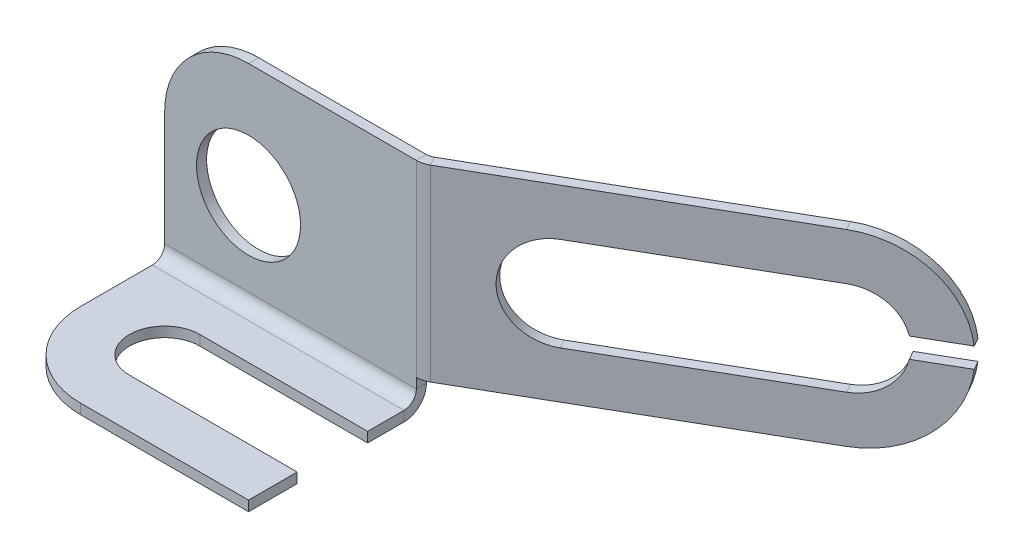
ISO-10303-21;
HEADER;
FILE_DESCRIPTION(('STEP AP214'),'2;1');
FILE_NAME('part.step','',(''),(''),'','','');
FILE_SCHEMA(('AUTOMOTIVE_DESIGN { 1 0 10303 214 1 1 1 1 }'));
ENDSEC;
DATA;
#1=APPLICATION_CONTEXT('core data for automotive mechanical design processes');
#2=APPLICATION_PROTOCOL_DEFINITION('international standard','automotive_design',2000,#1);
#3=PRODUCT_CONTEXT('',#1,'mechanical');
#4=PRODUCT('Part','Part','',(#3));
#5=PRODUCT_RELATED_PRODUCT_CATEGORY('part','',(#4));
#6=PRODUCT_DEFINITION_FORMATION('','',#4);
#7=PRODUCT_DEFINITION_CONTEXT('part definition',#1,'design');
#8=PRODUCT_DEFINITION('design','',#6,#7);
#9=PRODUCT_DEFINITION_SHAPE('','',#8);
#10=(LENGTH_UNIT() NAMED_UNIT(*) SI_UNIT(.MILLI.,.METRE.));
#11=(NAMED_UNIT(*) PLANE_ANGLE_UNIT() SI_UNIT($,.RADIAN.));
#12=(NAMED_UNIT(*) SI_UNIT($,.STERADIAN.) SOLID_ANGLE_UNIT());
#13=UNCERTAINTY_MEASURE_WITH_UNIT(LENGTH_MEASURE(1.E-05),#10,'distance_accuracy_value','');
#14=(GEOMETRIC_REPRESENTATION_CONTEXT(3) GLOBAL_UNCERTAINTY_ASSIGNED_CONTEXT((#13)) GLOBAL_UNIT_ASSIGNED_CONTEXT((#10,
#11,#12)) REPRESENTATION_CONTEXT('',''));
#15=CARTESIAN_POINT('',(0.,0.,0.));
#16=DIRECTION('',(0.,0.,1.));
#17=DIRECTION('',(1.,0.,0.));
#18=AXIS2_PLACEMENT_3D('',#15,#16,#17);
#19=CARTESIAN_POINT('',(28.7,1.2,0.));
#20=DIRECTION('',(0.,0.,1.));
#21=DIRECTION('',(1.,0.,0.));
#22=AXIS2_PLACEMENT_3D('',#19,#20,#21);
#23=PLANE('',#22);
#24=CARTESIAN_POINT('',(0.,0.,0.));
#25=DIRECTION('',(0.,0.,1.));
#26=DIRECTION('',(1.,0.,0.));
#27=AXIS2_PLACEMENT_3D('',#24,#25,#26);
#28=CIRCLE('',#27,3.1);
#29=CARTESIAN_POINT('',(3.1,0.,0.));
#30=VERTEX_POINT('',#29);
#31=EDGE_CURVE('E391',#30,#30,#28,.T.);
#32=ORIENTED_EDGE('',*,*,#31,.F.);
#33=EDGE_LOOP('',(#32));
#34=FACE_BOUND('',#33,.T.);
#35=DIRECTION('',(0.,1.,0.));
#36=VECTOR('',#35,1.);
#37=CARTESIAN_POINT('',(10.,-5.,0.));
#38=LINE('',#37,#36);
#39=CARTESIAN_POINT('',(10.,-5.,0.));
#40=VERTEX_POINT('',#39);
#41=CARTESIAN_POINT('',(10.,-4.4,0.));
#42=VERTEX_POINT('',#41);
#43=EDGE_CURVE('E130',#40,#42,#38,.T.);
#44=ORIENTED_EDGE('',*,*,#43,.T.);
#45=DIRECTION('',(0.,1.,0.));
#46=VECTOR('',#45,1.);
#47=CARTESIAN_POINT('',(10.,1.2,0.));
#48=LINE('',#47,#46);
#49=CARTESIAN_POINT('',(10.,6.8,0.));
#50=VERTEX_POINT('',#49);
#51=EDGE_CURVE('E94',#42,#50,#48,.T.);
#52=ORIENTED_EDGE('',*,*,#51,.T.);
#53=DIRECTION('',(-1.,0.,0.));
#54=VECTOR('',#53,1.);
#55=CARTESIAN_POINT('',(10.,6.8,0.));
#56=LINE('',#55,#54);
#57=CARTESIAN_POINT('',(0.,6.8,0.));
#58=VERTEX_POINT('',#57);
#59=EDGE_CURVE('E403',#50,#58,#56,.T.);
#60=ORIENTED_EDGE('',*,*,#59,.T.);
#61=CARTESIAN_POINT('',(0.,1.8,0.));
#62=DIRECTION('',(0.,0.,1.));
#63=DIRECTION('',(1.,0.,0.));
#64=AXIS2_PLACEMENT_3D('',#61,#62,#63);
#65=CIRCLE('',#64,5.);
#66=CARTESIAN_POINT('',(-5.,1.8,0.));
#67=VERTEX_POINT('',#66);
#68=EDGE_CURVE('E417',#58,#67,#65,.T.);
#69=ORIENTED_EDGE('',*,*,#68,.T.);
#70=DIRECTION('',(0.,-1.,0.));
#71=VECTOR('',#70,1.);
#72=CARTESIAN_POINT('',(-5.,-5.,0.));
#73=LINE('',#72,#71);
#74=CARTESIAN_POINT('',(-5.,-5.,0.));
#75=VERTEX_POINT('',#74);
#76=EDGE_CURVE('E420',#67,#75,#73,.T.);
#77=ORIENTED_EDGE('',*,*,#76,.T.);
#78=DIRECTION('',(1.,0.,0.));
#79=VECTOR('',#78,1.);
#80=CARTESIAN_POINT('',(-5.,-5.,0.));
#81=LINE('',#80,#79);
#82=EDGE_CURVE('E423',#75,#40,#81,.T.);
#83=ORIENTED_EDGE('',*,*,#82,.T.);
#84=EDGE_LOOP('',(#44,#52,#60,#69,#77,#83));
#85=FACE_BOUND('',#84,.T.);
#86=ADVANCED_FACE('F86',(#34,#85),#23,.T.);
#87=CARTESIAN_POINT('',(10.,6.8,-0.6));
#88=DIRECTION('',(0.,1.,0.));
#89=DIRECTION('',(0.,0.,1.));
#90=AXIS2_PLACEMENT_3D('',#87,#88,#89);
#91=PLANE('',#90);
#92=ORIENTED_EDGE('',*,*,#59,.F.);
#93=DIRECTION('',(0.,0.,-1.));
#94=VECTOR('',#93,1.);
#95=CARTESIAN_POINT('',(10.,6.8,-0.6));
#96=LINE('',#95,#94);
#97=CARTESIAN_POINT('',(10.,6.8,-0.6));
#98=VERTEX_POINT('',#97);
#99=EDGE_CURVE('E437',#50,#98,#96,.T.);
#100=ORIENTED_EDGE('',*,*,#99,.T.);
#101=DIRECTION('',(-1.,0.,0.));
#102=VECTOR('',#101,1.);
#103=CARTESIAN_POINT('',(28.7,6.8,-0.6));
#104=LINE('',#103,#102);
#105=CARTESIAN_POINT('',(0.,6.8,-0.6));
#106=VERTEX_POINT('',#105);
#107=EDGE_CURVE('E89',#98,#106,#104,.T.);
#108=ORIENTED_EDGE('',*,*,#107,.T.);
#109=DIRECTION('',(0.,0.,1.));
#110=VECTOR('',#109,1.);
#111=CARTESIAN_POINT('',(0.,6.8,-0.6));
#112=LINE('',#111,#110);
#113=EDGE_CURVE('E416',#106,#58,#112,.T.);
#114=ORIENTED_EDGE('',*,*,#113,.T.);
#115=EDGE_LOOP('',(#92,#100,#108,#114));
#116=FACE_BOUND('',#115,.T.);
#117=ADVANCED_FACE('F443',(#116),#91,.T.);
#118=CARTESIAN_POINT('',(10.,-5.,-0.6));
#119=DIRECTION('',(1.,0.,0.));
#120=DIRECTION('',(0.,0.,-1.));
#121=AXIS2_PLACEMENT_3D('',#118,#119,#120);
#122=PLANE('',#121);
#123=ORIENTED_EDGE('',*,*,#43,.F.);
#124=DIRECTION('',(0.,0.,1.));
#125=VECTOR('',#124,1.);
#126=CARTESIAN_POINT('',(10.,-5.,-0.6));
#127=LINE('',#126,#125);
#128=CARTESIAN_POINT('',(10.,-5.,-0.6));
#129=VERTEX_POINT('',#128);
#130=EDGE_CURVE('E426',#129,#40,#127,.T.);
#131=ORIENTED_EDGE('',*,*,#130,.F.);
#132=DIRECTION('',(0.,1.,0.));
#133=VECTOR('',#132,1.);
#134=CARTESIAN_POINT('',(10.,-5.,-0.6));
#135=LINE('',#134,#133);
#136=CARTESIAN_POINT('',(10.,-4.39999999999999,-0.6));
#137=VERTEX_POINT('',#136);
#138=EDGE_CURVE('E413',#129,#137,#135,.T.);
#139=ORIENTED_EDGE('',*,*,#138,.T.);
#140=DIRECTION('',(0.,0.,1.));
#141=VECTOR('',#140,1.);
#142=CARTESIAN_POINT('',(10.,-4.4,-0.6));
#143=LINE('',#142,#141);
#144=EDGE_CURVE('E13',#137,#42,#143,.T.);
#145=ORIENTED_EDGE('',*,*,#144,.T.);
#146=EDGE_LOOP('',(#123,#131,#139,#145));
#147=FACE_BOUND('',#146,.T.);
#148=ADVANCED_FACE('F523',(#147),#122,.T.);
#149=CARTESIAN_POINT('',(-5.,-5.,-0.6));
#150=DIRECTION('',(-1.,0.,0.));
#151=DIRECTION('',(0.,0.,1.));
#152=AXIS2_PLACEMENT_3D('',#149,#150,#151);
#153=PLANE('',#152);
#154=ORIENTED_EDGE('',*,*,#76,.F.);
#155=DIRECTION('',(0.,0.,1.));
#156=VECTOR('',#155,1.);
#157=CARTESIAN_POINT('',(-5.,1.8,-0.6));
#158=LINE('',#157,#156);
#159=CARTESIAN_POINT('',(-5.,1.8,-0.6));
#160=VERTEX_POINT('',#159);
#161=EDGE_CURVE('E432',#160,#67,#158,.T.);
#162=ORIENTED_EDGE('',*,*,#161,.F.);
#163=DIRECTION('',(0.,-1.,0.));
#164=VECTOR('',#163,1.);
#165=CARTESIAN_POINT('',(-5.,0.,-0.6));
#166=LINE('',#165,#164);
#167=CARTESIAN_POINT('',(-5.,-5.,-0.6));
#168=VERTEX_POINT('',#167);
#169=EDGE_CURVE('E111',#160,#168,#166,.T.);
#170=ORIENTED_EDGE('',*,*,#169,.T.);
#171=DIRECTION('',(0.,0.,1.));
#172=VECTOR('',#171,1.);
#173=CARTESIAN_POINT('',(-5.,-5.,-0.6));
#174=LINE('',#173,#172);
#175=EDGE_CURVE('E430',#168,#75,#174,.T.);
#176=ORIENTED_EDGE('',*,*,#175,.T.);
#177=EDGE_LOOP('',(#154,#162,#170,#176));
#178=FACE_BOUND('',#177,.T.);
#179=ADVANCED_FACE('F447',(#178),#153,.T.);
#180=CARTESIAN_POINT('',(0.,1.8,-0.6));
#181=DIRECTION('',(0.,0.,1.));
#182=DIRECTION('',(1.,0.,0.));
#183=AXIS2_PLACEMENT_3D('',#180,#181,#182);
#184=CYLINDRICAL_SURFACE('',#183,5.);
#185=ORIENTED_EDGE('',*,*,#68,.F.);
#186=ORIENTED_EDGE('',*,*,#113,.F.);
#187=CARTESIAN_POINT('',(0.,1.8,-0.6));
#188=DIRECTION('',(0.,0.,1.));
#189=DIRECTION('',(1.,0.,0.));
#190=AXIS2_PLACEMENT_3D('',#187,#188,#189);
#191=CIRCLE('',#190,5.);
#192=EDGE_CURVE('E406',#106,#160,#191,.T.);
#193=ORIENTED_EDGE('',*,*,#192,.T.);
#194=ORIENTED_EDGE('',*,*,#161,.T.);
#195=EDGE_LOOP('',(#185,#186,#193,#194));
#196=FACE_BOUND('',#195,.T.);
#197=ADVANCED_FACE('F446',(#196),#184,.T.);
#198=CARTESIAN_POINT('',(28.7,1.2,-0.6));
#199=DIRECTION('',(0.,0.,1.));
#200=DIRECTION('',(1.,0.,0.));
#201=AXIS2_PLACEMENT_3D('',#198,#199,#200);
#202=PLANE('',#201);
#203=DIRECTION('',(0.,1.,0.));
#204=VECTOR('',#203,1.);
#205=CARTESIAN_POINT('',(10.,1.2,-0.6));
#206=LINE('',#205,#204);
#207=EDGE_CURVE('E429',#137,#98,#206,.T.);
#208=ORIENTED_EDGE('',*,*,#207,.F.);
#209=ORIENTED_EDGE('',*,*,#138,.F.);
#210=DIRECTION('',(1.,0.,0.));
#211=VECTOR('',#210,1.);
#212=CARTESIAN_POINT('',(-5.,-5.,-0.6));
#213=LINE('',#212,#211);
#214=EDGE_CURVE('E410',#168,#129,#213,.T.);
#215=ORIENTED_EDGE('',*,*,#214,.F.);
#216=ORIENTED_EDGE('',*,*,#169,.F.);
#217=ORIENTED_EDGE('',*,*,#192,.F.);
#218=ORIENTED_EDGE('',*,*,#107,.F.);
#219=EDGE_LOOP('',(#208,#209,#215,#216,#217,#218));
#220=FACE_BOUND('',#219,.T.);
#221=CARTESIAN_POINT('',(0.,0.,-0.6));
#222=DIRECTION('',(0.,0.,1.));
#223=DIRECTION('',(1.,0.,0.));
#224=AXIS2_PLACEMENT_3D('',#221,#222,#223);
#225=CIRCLE('',#224,3.1);
#226=CARTESIAN_POINT('',(3.1,0.,-0.6));
#227=VERTEX_POINT('',#226);
#228=EDGE_CURVE('E400',#227,#227,#225,.T.);
#229=ORIENTED_EDGE('',*,*,#228,.T.);
#230=EDGE_LOOP('',(#229));
#231=FACE_BOUND('',#230,.T.);
#232=ADVANCED_FACE('F450',(#220,#231),#202,.F.);
#233=CARTESIAN_POINT('',(0.,0.,-0.6));
#234=DIRECTION('',(0.,0.,1.));
#235=DIRECTION('',(1.,0.,0.));
#236=AXIS2_PLACEMENT_3D('',#233,#234,#235);
#237=CYLINDRICAL_SURFACE('',#236,3.1);
#238=ORIENTED_EDGE('',*,*,#228,.F.);
#239=EDGE_LOOP('',(#238));
#240=FACE_BOUND('',#239,.T.);
#241=ORIENTED_EDGE('',*,*,#31,.T.);
#242=EDGE_LOOP('',(#241));
#243=FACE_BOUND('',#242,.T.);
#244=ADVANCED_FACE('F526',(#240,#243),#237,.F.);
#245=CARTESIAN_POINT('',(-5.,-5.,0.7366));
#246=DIRECTION('',(-1.,0.,0.));
#247=DIRECTION('',(0.,0.,1.));
#248=AXIS2_PLACEMENT_3D('',#245,#246,#247);
#249=PLANE('',#248);
#250=DIRECTION('',(0.,1.,0.));
#251=VECTOR('',#250,1.);
#252=CARTESIAN_POINT('',(-5.,-6.3366,0.736599999999995));
#253=LINE('',#252,#251);
#254=CARTESIAN_POINT('',(-5.,-5.7366,0.736599999999997));
#255=VERTEX_POINT('',#254);
#256=CARTESIAN_POINT('',(-5.,-6.3366,0.736599999999995));
#257=VERTEX_POINT('',#256);
#258=EDGE_CURVE('E319',#255,#257,#253,.F.);
#259=ORIENTED_EDGE('',*,*,#258,.F.);
#260=CARTESIAN_POINT('',(-5.,-5.,0.7366));
#261=DIRECTION('',(1.,0.,0.));
#262=DIRECTION('',(0.,0.,-1.));
#263=AXIS2_PLACEMENT_3D('',#260,#261,#262);
#264=CIRCLE('',#263,0.7366);
#265=EDGE_CURVE('E395',#75,#255,#264,.F.);
#266=ORIENTED_EDGE('',*,*,#265,.F.);
#267=ORIENTED_EDGE('',*,*,#175,.F.);
#268=CARTESIAN_POINT('',(-5.,-5.,0.7366));
#269=DIRECTION('',(1.,0.,0.));
#270=DIRECTION('',(0.,0.,-1.));
#271=AXIS2_PLACEMENT_3D('',#268,#269,#270);
#272=CIRCLE('',#271,1.3366);
#273=EDGE_CURVE('E388',#168,#257,#272,.F.);
#274=ORIENTED_EDGE('',*,*,#273,.T.);
#275=EDGE_LOOP('',(#259,#266,#267,#274));
#276=FACE_BOUND('',#275,.T.);
#277=ADVANCED_FACE('F457',(#276),#249,.T.);
#278=CARTESIAN_POINT('',(10.,-5.,0.7366));
#279=DIRECTION('',(-1.,0.,0.));
#280=DIRECTION('',(0.,0.,1.));
#281=AXIS2_PLACEMENT_3D('',#278,#279,#280);
#282=PLANE('',#281);
#283=CARTESIAN_POINT('',(10.,-5.,0.7366));
#284=DIRECTION('',(1.,0.,0.));
#285=DIRECTION('',(0.,0.,-1.));
#286=AXIS2_PLACEMENT_3D('',#283,#284,#285);
#287=CIRCLE('',#286,0.7366);
#288=CARTESIAN_POINT('',(10.,-5.7366,0.736599999999997));
#289=VERTEX_POINT('',#288);
#290=EDGE_CURVE('E341',#289,#40,#287,.T.);
#291=ORIENTED_EDGE('',*,*,#290,.F.);
#292=DIRECTION('',(0.,1.,0.));
#293=VECTOR('',#292,1.);
#294=CARTESIAN_POINT('',(10.,-5.7366,0.736599999999997));
#295=LINE('',#294,#293);
#296=CARTESIAN_POINT('',(10.,-6.3366,0.736599999999995));
#297=VERTEX_POINT('',#296);
#298=EDGE_CURVE('E381',#289,#297,#295,.F.);
#299=ORIENTED_EDGE('',*,*,#298,.T.);
#300=CARTESIAN_POINT('',(10.,-5.,0.7366));
#301=DIRECTION('',(1.,0.,0.));
#302=DIRECTION('',(0.,0.,-1.));
#303=AXIS2_PLACEMENT_3D('',#300,#301,#302);
#304=CIRCLE('',#303,1.3366);
#305=EDGE_CURVE('E392',#297,#129,#304,.T.);
#306=ORIENTED_EDGE('',*,*,#305,.T.);
#307=ORIENTED_EDGE('',*,*,#130,.T.);
#308=EDGE_LOOP('',(#291,#299,#306,#307));
#309=FACE_BOUND('',#308,.T.);
#310=ADVANCED_FACE('F534',(#309),#282,.F.);
#311=CARTESIAN_POINT('',(10.,-5.,0.7366));
#312=DIRECTION('',(1.,0.,0.));
#313=DIRECTION('',(0.,-1.,0.));
#314=AXIS2_PLACEMENT_3D('',#311,#312,#313);
#315=CYLINDRICAL_SURFACE('',#314,1.3366);
#316=ORIENTED_EDGE('',*,*,#214,.T.);
#317=ORIENTED_EDGE('',*,*,#305,.F.);
#318=DIRECTION('',(1.,0.,0.));
#319=VECTOR('',#318,1.);
#320=CARTESIAN_POINT('',(-5.,-6.3366,0.736599999999995));
#321=LINE('',#320,#319);
#322=EDGE_CURVE('E379',#297,#257,#321,.F.);
#323=ORIENTED_EDGE('',*,*,#322,.T.);
#324=ORIENTED_EDGE('',*,*,#273,.F.);
#325=EDGE_LOOP('',(#316,#317,#323,#324));
#326=FACE_BOUND('',#325,.T.);
#327=ADVANCED_FACE('F458',(#326),#315,.T.);
#328=CARTESIAN_POINT('',(10.,-5.,0.7366));
#329=DIRECTION('',(1.,0.,0.));
#330=DIRECTION('',(0.,-1.,0.));
#331=AXIS2_PLACEMENT_3D('',#328,#329,#330);
#332=CYLINDRICAL_SURFACE('',#331,0.7366);
#333=ORIENTED_EDGE('',*,*,#82,.F.);
#334=ORIENTED_EDGE('',*,*,#265,.T.);
#335=DIRECTION('',(1.,0.,0.));
#336=VECTOR('',#335,1.);
#337=CARTESIAN_POINT('',(-5.,-5.7366,0.736599999999997));
#338=LINE('',#337,#336);
#339=EDGE_CURVE('E384',#255,#289,#338,.T.);
#340=ORIENTED_EDGE('',*,*,#339,.T.);
#341=ORIENTED_EDGE('',*,*,#290,.T.);
#342=EDGE_LOOP('',(#333,#334,#340,#341));
#343=FACE_BOUND('',#342,.T.);
#344=ADVANCED_FACE('F505',(#343),#332,.F.);
#345=CARTESIAN_POINT('',(-5.,-6.3366,0.));
#346=DIRECTION('',(1.,0.,0.));
#347=DIRECTION('',(0.,0.,-1.));
#348=AXIS2_PLACEMENT_3D('',#345,#346,#347);
#349=PLANE('',#348);
#350=ORIENTED_EDGE('',*,*,#258,.T.);
#351=DIRECTION('',(0.,0.,-1.));
#352=VECTOR('',#351,1.);
#353=CARTESIAN_POINT('',(-5.,-6.33660000000001,5.));
#354=LINE('',#353,#352);
#355=CARTESIAN_POINT('',(-5.,-6.33660000000001,4.99999999999998));
#356=VERTEX_POINT('',#355);
#357=EDGE_CURVE('E359',#356,#257,#354,.T.);
#358=ORIENTED_EDGE('',*,*,#357,.F.);
#359=DIRECTION('',(0.,1.,0.));
#360=VECTOR('',#359,1.);
#361=CARTESIAN_POINT('',(-5.,-6.33660000000001,4.99999999999996));
#362=LINE('',#361,#360);
#363=CARTESIAN_POINT('',(-5.,-5.73660000000002,4.99999999999998));
#364=VERTEX_POINT('',#363);
#365=EDGE_CURVE('E323',#356,#364,#362,.T.);
#366=ORIENTED_EDGE('',*,*,#365,.T.);
#367=DIRECTION('',(0.,0.,1.));
#368=VECTOR('',#367,1.);
#369=CARTESIAN_POINT('',(-5.,-5.7366,0.));
#370=LINE('',#369,#368);
#371=EDGE_CURVE('E376',#364,#255,#370,.F.);
#372=ORIENTED_EDGE('',*,*,#371,.T.);
#373=EDGE_LOOP('',(#350,#358,#366,#372));
#374=FACE_BOUND('',#373,.T.);
#375=ADVANCED_FACE('F501',(#374),#349,.F.);
#376=CARTESIAN_POINT('',(10.,-6.33660000000001,2.9));
#377=DIRECTION('',(-1.,0.,0.));
#378=DIRECTION('',(0.,0.,1.));
#379=AXIS2_PLACEMENT_3D('',#376,#377,#378);
#380=PLANE('',#379);
#381=ORIENTED_EDGE('',*,*,#298,.F.);
#382=DIRECTION('',(0.,0.,-1.));
#383=VECTOR('',#382,1.);
#384=CARTESIAN_POINT('',(10.,-5.73660000000001,2.9));
#385=LINE('',#384,#383);
#386=CARTESIAN_POINT('',(10.,-5.73660000000001,2.9));
#387=VERTEX_POINT('',#386);
#388=EDGE_CURVE('E374',#289,#387,#385,.F.);
#389=ORIENTED_EDGE('',*,*,#388,.T.);
#390=DIRECTION('',(0.,1.,0.));
#391=VECTOR('',#390,1.);
#392=CARTESIAN_POINT('',(10.,-6.33660000000001,2.9));
#393=LINE('',#392,#391);
#394=CARTESIAN_POINT('',(10.,-6.33660000000001,2.9));
#395=VERTEX_POINT('',#394);
#396=EDGE_CURVE('E338',#395,#387,#393,.T.);
#397=ORIENTED_EDGE('',*,*,#396,.F.);
#398=DIRECTION('',(0.,0.,1.));
#399=VECTOR('',#398,1.);
#400=CARTESIAN_POINT('',(10.,-6.33660000000001,5.));
#401=LINE('',#400,#399);
#402=EDGE_CURVE('E357',#297,#395,#401,.T.);
#403=ORIENTED_EDGE('',*,*,#402,.F.);
#404=EDGE_LOOP('',(#381,#389,#397,#403));
#405=FACE_BOUND('',#404,.T.);
#406=ADVANCED_FACE('F467',(#405),#380,.F.);
#407=CARTESIAN_POINT('',(0.,-6.33660000000001,5.));
#408=DIRECTION('',(0.,1.,0.));
#409=DIRECTION('',(0.,0.,1.));
#410=AXIS2_PLACEMENT_3D('',#407,#408,#409);
#411=PLANE('',#410);
#412=ORIENTED_EDGE('',*,*,#322,.F.);
#413=ORIENTED_EDGE('',*,*,#402,.T.);
#414=DIRECTION('',(-1.,0.,0.));
#415=VECTOR('',#414,1.);
#416=CARTESIAN_POINT('',(0.,-6.33660000000001,2.9));
#417=LINE('',#416,#415);
#418=CARTESIAN_POINT('',(0.,-6.33660000000001,2.9));
#419=VERTEX_POINT('',#418);
#420=EDGE_CURVE('E355',#395,#419,#417,.T.);
#421=ORIENTED_EDGE('',*,*,#420,.T.);
#422=CARTESIAN_POINT('',(0.,-6.33660000000001,5.));
#423=DIRECTION('',(0.,1.,0.));
#424=DIRECTION('',(0.,0.,1.));
#425=AXIS2_PLACEMENT_3D('',#422,#423,#424);
#426=CIRCLE('',#425,2.1);
#427=CARTESIAN_POINT('',(0.,-6.33660000000002,7.1));
#428=VERTEX_POINT('',#427);
#429=EDGE_CURVE('E353',#419,#428,#426,.T.);
#430=ORIENTED_EDGE('',*,*,#429,.T.);
#431=DIRECTION('',(1.,0.,0.));
#432=VECTOR('',#431,1.);
#433=CARTESIAN_POINT('',(0.,-6.33660000000002,7.1));
#434=LINE('',#433,#432);
#435=CARTESIAN_POINT('',(10.,-6.33660000000002,7.1));
#436=VERTEX_POINT('',#435);
#437=EDGE_CURVE('E351',#428,#436,#434,.T.);
#438=ORIENTED_EDGE('',*,*,#437,.T.);
#439=DIRECTION('',(0.,0.,1.));
#440=VECTOR('',#439,1.);
#441=CARTESIAN_POINT('',(10.,-6.33660000000001,4.99999999999999));
#442=LINE('',#441,#440);
#443=CARTESIAN_POINT('',(10.,-6.33660000000003,10.));
#444=VERTEX_POINT('',#443);
#445=EDGE_CURVE('E349',#436,#444,#442,.T.);
#446=ORIENTED_EDGE('',*,*,#445,.T.);
#447=DIRECTION('',(-1.,0.,0.));
#448=VECTOR('',#447,1.);
#449=CARTESIAN_POINT('',(0.,-6.33660000000003,10.));
#450=LINE('',#449,#448);
#451=CARTESIAN_POINT('',(0.,-6.33660000000003,10.));
#452=VERTEX_POINT('',#451);
#453=EDGE_CURVE('E347',#444,#452,#450,.T.);
#454=ORIENTED_EDGE('',*,*,#453,.T.);
#455=CARTESIAN_POINT('',(0.,-6.33660000000001,5.));
#456=DIRECTION('',(0.,1.,0.));
#457=DIRECTION('',(0.,0.,1.));
#458=AXIS2_PLACEMENT_3D('',#455,#456,#457);
#459=CIRCLE('',#458,5.);
#460=EDGE_CURVE('E327',#452,#356,#459,.F.);
#461=ORIENTED_EDGE('',*,*,#460,.T.);
#462=ORIENTED_EDGE('',*,*,#357,.T.);
#463=EDGE_LOOP('',(#412,#413,#421,#430,#438,#446,#454,#461,#462));
#464=FACE_BOUND('',#463,.T.);
#465=ADVANCED_FACE('F462',(#464),#411,.F.);
#466=CARTESIAN_POINT('',(0.,-5.73660000000002,5.));
#467=DIRECTION('',(0.,1.,0.));
#468=DIRECTION('',(0.,0.,1.));
#469=AXIS2_PLACEMENT_3D('',#466,#467,#468);
#470=PLANE('',#469);
#471=ORIENTED_EDGE('',*,*,#388,.F.);
#472=ORIENTED_EDGE('',*,*,#339,.F.);
#473=ORIENTED_EDGE('',*,*,#371,.F.);
#474=CARTESIAN_POINT('',(0.,-5.73660000000002,5.));
#475=DIRECTION('',(0.,1.,0.));
#476=DIRECTION('',(0.,0.,1.));
#477=AXIS2_PLACEMENT_3D('',#474,#475,#476);
#478=CIRCLE('',#477,5.);
#479=CARTESIAN_POINT('',(0.,-5.73660000000003,10.));
#480=VERTEX_POINT('',#479);
#481=EDGE_CURVE('E362',#480,#364,#478,.F.);
#482=ORIENTED_EDGE('',*,*,#481,.F.);
#483=DIRECTION('',(1.,0.,0.));
#484=VECTOR('',#483,1.);
#485=CARTESIAN_POINT('',(0.,-5.73660000000003,10.));
#486=LINE('',#485,#484);
#487=CARTESIAN_POINT('',(10.,-5.73660000000003,10.));
#488=VERTEX_POINT('',#487);
#489=EDGE_CURVE('E364',#488,#480,#486,.F.);
#490=ORIENTED_EDGE('',*,*,#489,.F.);
#491=DIRECTION('',(0.,0.,-1.));
#492=VECTOR('',#491,1.);
#493=CARTESIAN_POINT('',(10.,-5.73660000000003,10.));
#494=LINE('',#493,#492);
#495=CARTESIAN_POINT('',(10.,-5.73660000000002,7.1));
#496=VERTEX_POINT('',#495);
#497=EDGE_CURVE('E366',#496,#488,#494,.F.);
#498=ORIENTED_EDGE('',*,*,#497,.F.);
#499=DIRECTION('',(-1.,0.,0.));
#500=VECTOR('',#499,1.);
#501=CARTESIAN_POINT('',(0.,-5.73660000000002,7.1));
#502=LINE('',#501,#500);
#503=CARTESIAN_POINT('',(0.,-5.73660000000002,7.1));
#504=VERTEX_POINT('',#503);
#505=EDGE_CURVE('E368',#504,#496,#502,.F.);
#506=ORIENTED_EDGE('',*,*,#505,.F.);
#507=CARTESIAN_POINT('',(0.,-5.73660000000002,5.));
#508=DIRECTION('',(0.,1.,0.));
#509=DIRECTION('',(0.,0.,1.));
#510=AXIS2_PLACEMENT_3D('',#507,#508,#509);
#511=CIRCLE('',#510,2.1);
#512=CARTESIAN_POINT('',(0.,-5.73660000000001,2.9));
#513=VERTEX_POINT('',#512);
#514=EDGE_CURVE('E370',#513,#504,#511,.T.);
#515=ORIENTED_EDGE('',*,*,#514,.F.);
#516=DIRECTION('',(1.,0.,0.));
#517=VECTOR('',#516,1.);
#518=CARTESIAN_POINT('',(0.,-5.73660000000001,2.9));
#519=LINE('',#518,#517);
#520=EDGE_CURVE('E372',#387,#513,#519,.F.);
#521=ORIENTED_EDGE('',*,*,#520,.F.);
#522=EDGE_LOOP('',(#471,#472,#473,#482,#490,#498,#506,#515,#521));
#523=FACE_BOUND('',#522,.T.);
#524=ADVANCED_FACE('F508',(#523),#470,.T.);
#525=CARTESIAN_POINT('',(0.,-6.33660000000001,2.9));
#526=DIRECTION('',(0.,0.,-1.));
#527=DIRECTION('',(0.,1.,0.));
#528=AXIS2_PLACEMENT_3D('',#525,#526,#527);
#529=PLANE('',#528);
#530=ORIENTED_EDGE('',*,*,#520,.T.);
#531=DIRECTION('',(0.,1.,0.));
#532=VECTOR('',#531,1.);
#533=CARTESIAN_POINT('',(0.,-6.33660000000001,2.9));
#534=LINE('',#533,#532);
#535=EDGE_CURVE('E334',#419,#513,#534,.T.);
#536=ORIENTED_EDGE('',*,*,#535,.F.);
#537=ORIENTED_EDGE('',*,*,#420,.F.);
#538=ORIENTED_EDGE('',*,*,#396,.T.);
#539=EDGE_LOOP('',(#530,#536,#537,#538));
#540=FACE_BOUND('',#539,.T.);
#541=ADVANCED_FACE('F473',(#540),#529,.F.);
#542=CARTESIAN_POINT('',(0.,-6.33660000000001,5.));
#543=DIRECTION('',(0.,1.,0.));
#544=DIRECTION('',(0.,0.,1.));
#545=AXIS2_PLACEMENT_3D('',#542,#543,#544);
#546=CYLINDRICAL_SURFACE('',#545,2.1);
#547=ORIENTED_EDGE('',*,*,#514,.T.);
#548=DIRECTION('',(0.,1.,0.));
#549=VECTOR('',#548,1.);
#550=CARTESIAN_POINT('',(0.,-6.33660000000002,7.1));
#551=LINE('',#550,#549);
#552=EDGE_CURVE('E331',#428,#504,#551,.T.);
#553=ORIENTED_EDGE('',*,*,#552,.F.);
#554=ORIENTED_EDGE('',*,*,#429,.F.);
#555=ORIENTED_EDGE('',*,*,#535,.T.);
#556=EDGE_LOOP('',(#547,#553,#554,#555));
#557=FACE_BOUND('',#556,.T.);
#558=ADVANCED_FACE('F479',(#557),#546,.F.);
#559=CARTESIAN_POINT('',(0.,-6.33660000000002,7.1));
#560=DIRECTION('',(0.,0.,1.));
#561=DIRECTION('',(0.,-1.,0.));
#562=AXIS2_PLACEMENT_3D('',#559,#560,#561);
#563=PLANE('',#562);
#564=ORIENTED_EDGE('',*,*,#505,.T.);
#565=DIRECTION('',(0.,1.,0.));
#566=VECTOR('',#565,1.);
#567=CARTESIAN_POINT('',(10.,-6.33660000000002,7.1));
#568=LINE('',#567,#566);
#569=EDGE_CURVE('E335',#436,#496,#568,.T.);
#570=ORIENTED_EDGE('',*,*,#569,.F.);
#571=ORIENTED_EDGE('',*,*,#437,.F.);
#572=ORIENTED_EDGE('',*,*,#552,.T.);
#573=EDGE_LOOP('',(#564,#570,#571,#572));
#574=FACE_BOUND('',#573,.T.);
#575=ADVANCED_FACE('F483',(#574),#563,.F.);
#576=CARTESIAN_POINT('',(10.,-6.33660000000003,10.));
#577=DIRECTION('',(-1.,0.,0.));
#578=DIRECTION('',(0.,0.,1.));
#579=AXIS2_PLACEMENT_3D('',#576,#577,#578);
#580=PLANE('',#579);
#581=ORIENTED_EDGE('',*,*,#497,.T.);
#582=DIRECTION('',(0.,1.,0.));
#583=VECTOR('',#582,1.);
#584=CARTESIAN_POINT('',(10.,-6.33660000000003,10.));
#585=LINE('',#584,#583);
#586=EDGE_CURVE('E330',#444,#488,#585,.T.);
#587=ORIENTED_EDGE('',*,*,#586,.F.);
#588=ORIENTED_EDGE('',*,*,#445,.F.);
#589=ORIENTED_EDGE('',*,*,#569,.T.);
#590=EDGE_LOOP('',(#581,#587,#588,#589));
#591=FACE_BOUND('',#590,.T.);
#592=ADVANCED_FACE('F488',(#591),#580,.F.);
#593=CARTESIAN_POINT('',(0.,-6.33660000000003,10.));
#594=DIRECTION('',(0.,0.,-1.));
#595=DIRECTION('',(0.,1.,0.));
#596=AXIS2_PLACEMENT_3D('',#593,#594,#595);
#597=PLANE('',#596);
#598=ORIENTED_EDGE('',*,*,#489,.T.);
#599=DIRECTION('',(0.,1.,0.));
#600=VECTOR('',#599,1.);
#601=CARTESIAN_POINT('',(0.,-6.33660000000003,10.));
#602=LINE('',#601,#600);
#603=EDGE_CURVE('E326',#452,#480,#602,.T.);
#604=ORIENTED_EDGE('',*,*,#603,.F.);
#605=ORIENTED_EDGE('',*,*,#453,.F.);
#606=ORIENTED_EDGE('',*,*,#586,.T.);
#607=EDGE_LOOP('',(#598,#604,#605,#606));
#608=FACE_BOUND('',#607,.T.);
#609=ADVANCED_FACE('F494',(#608),#597,.F.);
#610=CARTESIAN_POINT('',(0.,-6.33660000000001,5.));
#611=DIRECTION('',(0.,1.,0.));
#612=DIRECTION('',(0.,0.,1.));
#613=AXIS2_PLACEMENT_3D('',#610,#611,#612);
#614=CYLINDRICAL_SURFACE('',#613,5.);
#615=ORIENTED_EDGE('',*,*,#481,.T.);
#616=ORIENTED_EDGE('',*,*,#365,.F.);
#617=ORIENTED_EDGE('',*,*,#460,.F.);
#618=ORIENTED_EDGE('',*,*,#603,.T.);
#619=EDGE_LOOP('',(#615,#616,#617,#618));
#620=FACE_BOUND('',#619,.T.);
#621=ADVANCED_FACE('F498',(#620),#614,.T.);
#622=CARTESIAN_POINT('',(10.,-4.39999999999999,-1.3366));
#623=DIRECTION('',(0.,1.,0.));
#624=DIRECTION('',(0.,0.,1.));
#625=AXIS2_PLACEMENT_3D('',#622,#623,#624);
#626=PLANE('',#625);
#627=DIRECTION('',(0.500000000000001,0.,0.866025403784438));
#628=VECTOR('',#627,1.);
#629=CARTESIAN_POINT('',(10.3683,-4.4,-0.698685687572383));
#630=LINE('',#629,#628);
#631=CARTESIAN_POINT('',(10.3683,-4.39999999999999,-0.698685687572383));
#632=VERTEX_POINT('',#631);
#633=CARTESIAN_POINT('',(10.6683,-4.4,-0.17907044530172));
#634=VERTEX_POINT('',#633);
#635=EDGE_CURVE('E282',#632,#634,#630,.T.);
#636=ORIENTED_EDGE('',*,*,#635,.T.);
#637=CARTESIAN_POINT('',(10.,-4.39999999999999,-1.3366));
#638=DIRECTION('',(0.,-1.,0.));
#639=DIRECTION('',(0.,0.,-1.));
#640=AXIS2_PLACEMENT_3D('',#637,#638,#639);
#641=CIRCLE('',#640,1.3366);
#642=EDGE_CURVE('E102',#634,#42,#641,.T.);
#643=ORIENTED_EDGE('',*,*,#642,.T.);
#644=ORIENTED_EDGE('',*,*,#144,.F.);
#645=CARTESIAN_POINT('',(10.,-4.39999999999999,-1.3366));
#646=DIRECTION('',(0.,-1.,0.));
#647=DIRECTION('',(0.,0.,1.));
#648=AXIS2_PLACEMENT_3D('',#645,#646,#647);
#649=CIRCLE('',#648,0.7366);
#650=EDGE_CURVE('E312',#632,#137,#649,.T.);
#651=ORIENTED_EDGE('',*,*,#650,.F.);
#652=EDGE_LOOP('',(#636,#643,#644,#651));
#653=FACE_BOUND('',#652,.T.);
#654=ADVANCED_FACE('F564',(#653),#626,.F.);
#655=CARTESIAN_POINT('',(10.,6.8,-1.3366));
#656=DIRECTION('',(0.,-1.,0.));
#657=DIRECTION('',(0.,0.,-1.));
#658=AXIS2_PLACEMENT_3D('',#655,#656,#657);
#659=PLANE('',#658);
#660=CARTESIAN_POINT('',(10.,6.8,-1.3366));
#661=DIRECTION('',(0.,-1.,0.));
#662=DIRECTION('',(0.,0.,-1.));
#663=AXIS2_PLACEMENT_3D('',#660,#661,#662);
#664=CIRCLE('',#663,1.3366);
#665=CARTESIAN_POINT('',(10.6683,6.8,-0.17907044530172));
#666=VERTEX_POINT('',#665);
#667=EDGE_CURVE('E316',#50,#666,#664,.F.);
#668=ORIENTED_EDGE('',*,*,#667,.T.);
#669=DIRECTION('',(-0.500000000000001,0.,-0.866025403784438));
#670=VECTOR('',#669,1.);
#671=CARTESIAN_POINT('',(10.3683,6.8,-0.698685687572382));
#672=LINE('',#671,#670);
#673=CARTESIAN_POINT('',(10.3683,6.8,-0.698685687572383));
#674=VERTEX_POINT('',#673);
#675=EDGE_CURVE('E301',#666,#674,#672,.T.);
#676=ORIENTED_EDGE('',*,*,#675,.T.);
#677=CARTESIAN_POINT('',(10.,6.8,-1.3366));
#678=DIRECTION('',(0.,1.,0.));
#679=DIRECTION('',(0.,0.,-1.));
#680=AXIS2_PLACEMENT_3D('',#677,#678,#679);
#681=CIRCLE('',#680,0.7366);
#682=EDGE_CURVE('E315',#98,#674,#681,.T.);
#683=ORIENTED_EDGE('',*,*,#682,.F.);
#684=ORIENTED_EDGE('',*,*,#99,.F.);
#685=EDGE_LOOP('',(#668,#676,#683,#684));
#686=FACE_BOUND('',#685,.T.);
#687=ADVANCED_FACE('F569',(#686),#659,.F.);
#688=CARTESIAN_POINT('',(10.,12.4291847932699,-1.3366));
#689=DIRECTION('',(0.,-1.,0.));
#690=DIRECTION('',(0.,0.,-1.));
#691=AXIS2_PLACEMENT_3D('',#688,#689,#690);
#692=CYLINDRICAL_SURFACE('',#691,0.7366);
#693=ORIENTED_EDGE('',*,*,#207,.T.);
#694=ORIENTED_EDGE('',*,*,#682,.T.);
#695=DIRECTION('',(0.,1.,0.));
#696=VECTOR('',#695,1.);
#697=CARTESIAN_POINT('',(10.3683,1.2,-0.698685687572383));
#698=LINE('',#697,#696);
#699=EDGE_CURVE('E1008',#632,#674,#698,.T.);
#700=ORIENTED_EDGE('',*,*,#699,.F.);
#701=ORIENTED_EDGE('',*,*,#650,.T.);
#702=EDGE_LOOP('',(#693,#694,#700,#701));
#703=FACE_BOUND('',#702,.T.);
#704=ADVANCED_FACE('F581',(#703),#692,.F.);
#705=CARTESIAN_POINT('',(10.,12.4291847932699,-1.3366));
#706=DIRECTION('',(0.,-1.,0.));
#707=DIRECTION('',(0.,0.,-1.));
#708=AXIS2_PLACEMENT_3D('',#705,#706,#707);
#709=CYLINDRICAL_SURFACE('',#708,1.3366);
#710=ORIENTED_EDGE('',*,*,#51,.F.);
#711=ORIENTED_EDGE('',*,*,#642,.F.);
#712=DIRECTION('',(0.,1.,0.));
#713=VECTOR('',#712,1.);
#714=CARTESIAN_POINT('',(10.6683,1.2,-0.17907044530172));
#715=LINE('',#714,#713);
#716=EDGE_CURVE('E305',#634,#666,#715,.T.);
#717=ORIENTED_EDGE('',*,*,#716,.T.);
#718=ORIENTED_EDGE('',*,*,#667,.F.);
#719=EDGE_LOOP('',(#710,#711,#717,#718));
#720=FACE_BOUND('',#719,.T.);
#721=ADVANCED_FACE('F592',(#720),#709,.T.);
#722=CARTESIAN_POINT('',(26.0929289455277,1.2,-9.7773044421798));
#723=DIRECTION('',(0.500000000000001,0.,0.866025403784438));
#724=DIRECTION('',(0.866025403784438,0.,-0.500000000000001));
#725=AXIS2_PLACEMENT_3D('',#722,#723,#724);
#726=CYLINDRICAL_SURFACE('',#725,5.6);
#727=CARTESIAN_POINT('',(26.3929289455277,1.2,-9.25768919990914));
#728=DIRECTION('',(0.500000000000001,0.,0.866025403784438));
#729=DIRECTION('',(0.866025403784438,0.,-0.500000000000001));
#730=AXIS2_PLACEMENT_3D('',#727,#728,#729);
#731=CIRCLE('',#730,5.6);
#732=CARTESIAN_POINT('',(26.3929289455277,-4.4,-9.25768919990914));
#733=VERTEX_POINT('',#732);
#734=CARTESIAN_POINT('',(31.2147543260242,0.600000000000002,-12.0415713813242));
#735=VERTEX_POINT('',#734);
#736=EDGE_CURVE('E293',#733,#735,#731,.T.);
#737=ORIENTED_EDGE('',*,*,#736,.F.);
#738=DIRECTION('',(0.500000000000001,0.,0.866025403784438));
#739=VECTOR('',#738,1.);
#740=CARTESIAN_POINT('',(26.0929289455277,-4.4,-9.7773044421798));
#741=LINE('',#740,#739);
#742=CARTESIAN_POINT('',(26.0929289455277,-4.4,-9.7773044421798));
#743=VERTEX_POINT('',#742);
#744=EDGE_CURVE('E280',#743,#733,#741,.T.);
#745=ORIENTED_EDGE('',*,*,#744,.F.);
#746=CARTESIAN_POINT('',(26.0929289455277,1.2,-9.7773044421798));
#747=DIRECTION('',(0.500000000000001,0.,0.866025403784438));
#748=DIRECTION('',(0.866025403784438,0.,-0.500000000000001));
#749=AXIS2_PLACEMENT_3D('',#746,#747,#748);
#750=CIRCLE('',#749,5.6);
#751=CARTESIAN_POINT('',(30.9147543260242,0.600000000000002,-12.5611866235948));
#752=VERTEX_POINT('',#751);
#753=EDGE_CURVE('E291',#743,#752,#750,.T.);
#754=ORIENTED_EDGE('',*,*,#753,.T.);
#755=DIRECTION('',(0.500000000000001,0.,0.866025403784438));
#756=VECTOR('',#755,1.);
#757=CARTESIAN_POINT('',(30.9147543260242,0.600000000000002,-12.5611866235948));
#758=LINE('',#757,#756);
#759=EDGE_CURVE('E300',#752,#735,#758,.T.);
#760=ORIENTED_EDGE('',*,*,#759,.T.);
#761=EDGE_LOOP('',(#737,#745,#754,#760));
#762=FACE_BOUND('',#761,.T.);
#763=ADVANCED_FACE('F290',(#762),#726,.T.);
#764=CARTESIAN_POINT('',(28.4614728019931,0.600000000000001,-11.1447838752975));
#765=DIRECTION('',(0.,1.,0.));
#766=DIRECTION('',(-0.866025403784438,0.,0.500000000000001));
#767=AXIS2_PLACEMENT_3D('',#764,#765,#766);
#768=PLANE('',#767);
#769=DIRECTION('',(-0.866025403784438,0.,0.500000000000001));
#770=VECTOR('',#769,1.);
#771=CARTESIAN_POINT('',(28.7614728019931,0.600000000000001,-10.6251686330269));
#772=LINE('',#771,#770);
#773=CARTESIAN_POINT('',(28.7614728019931,0.600000000000001,-10.6251686330269));
#774=VERTEX_POINT('',#773);
#775=EDGE_CURVE('E1067',#735,#774,#772,.T.);
#776=ORIENTED_EDGE('',*,*,#775,.F.);
#777=ORIENTED_EDGE('',*,*,#759,.F.);
#778=DIRECTION('',(-0.866025403784438,0.,0.500000000000001));
#779=VECTOR('',#778,1.);
#780=CARTESIAN_POINT('',(28.4614728019931,0.600000000000001,-11.1447838752975));
#781=LINE('',#780,#779);
#782=CARTESIAN_POINT('',(28.4614728019931,0.600000000000001,-11.1447838752975));
#783=VERTEX_POINT('',#782);
#784=EDGE_CURVE('E299',#752,#783,#781,.T.);
#785=ORIENTED_EDGE('',*,*,#784,.T.);
#786=DIRECTION('',(0.500000000000001,0.,0.866025403784438));
#787=VECTOR('',#786,1.);
#788=CARTESIAN_POINT('',(28.4614728019931,0.600000000000001,-11.1447838752975));
#789=LINE('',#788,#787);
#790=EDGE_CURVE('E1063',#783,#774,#789,.T.);
#791=ORIENTED_EDGE('',*,*,#790,.T.);
#792=EDGE_LOOP('',(#776,#777,#785,#791));
#793=FACE_BOUND('',#792,.T.);
#794=ADVANCED_FACE('F613',(#793),#768,.T.);
#795=CARTESIAN_POINT('',(26.0929289455277,1.2,-9.7773044421798));
#796=DIRECTION('',(0.500000000000001,0.,0.866025403784438));
#797=DIRECTION('',(0.866025403784438,0.,-0.500000000000001));
#798=AXIS2_PLACEMENT_3D('',#795,#796,#797);
#799=CYLINDRICAL_SURFACE('',#798,2.8);
#800=CARTESIAN_POINT('',(26.3929289455277,1.2,-9.25768919990914));
#801=DIRECTION('',(-0.500000000000001,0.,-0.866025403784438));
#802=DIRECTION('',(0.866025403784438,0.,-0.500000000000001));
#803=AXIS2_PLACEMENT_3D('',#800,#801,#802);
#804=CIRCLE('',#803,2.8);
#805=CARTESIAN_POINT('',(26.3929289455277,-1.6,-9.25768919990914));
#806=VERTEX_POINT('',#805);
#807=EDGE_CURVE('E1069',#774,#806,#804,.T.);
#808=ORIENTED_EDGE('',*,*,#807,.F.);
#809=ORIENTED_EDGE('',*,*,#790,.F.);
#810=CARTESIAN_POINT('',(26.0929289455277,1.2,-9.7773044421798));
#811=DIRECTION('',(-0.500000000000001,0.,-0.866025403784438));
#812=DIRECTION('',(0.866025403784438,0.,-0.500000000000001));
#813=AXIS2_PLACEMENT_3D('',#810,#811,#812);
#814=CIRCLE('',#813,2.8);
#815=CARTESIAN_POINT('',(26.0929289455277,-1.6,-9.7773044421798));
#816=VERTEX_POINT('',#815);
#817=EDGE_CURVE('E1060',#783,#816,#814,.T.);
#818=ORIENTED_EDGE('',*,*,#817,.T.);
#819=DIRECTION('',(0.500000000000001,0.,0.866025403784438));
#820=VECTOR('',#819,1.);
#821=CARTESIAN_POINT('',(26.0929289455277,-1.6,-9.7773044421798));
#822=LINE('',#821,#820);
#823=EDGE_CURVE('E1058',#816,#806,#822,.T.);
#824=ORIENTED_EDGE('',*,*,#823,.T.);
#825=EDGE_LOOP('',(#808,#809,#818,#824));
#826=FACE_BOUND('',#825,.T.);
#827=ADVANCED_FACE('F624',(#826),#799,.F.);
#828=CARTESIAN_POINT('',(15.2676113982222,-1.6,-3.52730444217979));
#829=DIRECTION('',(0.,1.,0.));
#830=DIRECTION('',(0.500000000000001,0.,0.866025403784438));
#831=AXIS2_PLACEMENT_3D('',#828,#829,#830);
#832=PLANE('',#831);
#833=DIRECTION('',(-0.866025403784438,0.,0.500000000000001));
#834=VECTOR('',#833,1.);
#835=CARTESIAN_POINT('',(15.5676113982222,-1.6,-3.00768919990913));
#836=LINE('',#835,#834);
#837=CARTESIAN_POINT('',(15.5676113982222,-1.6,-3.00768919990913));
#838=VERTEX_POINT('',#837);
#839=EDGE_CURVE('E1073',#806,#838,#836,.T.);
#840=ORIENTED_EDGE('',*,*,#839,.F.);
#841=ORIENTED_EDGE('',*,*,#823,.F.);
#842=DIRECTION('',(-0.866025403784438,0.,0.500000000000001));
#843=VECTOR('',#842,1.);
#844=CARTESIAN_POINT('',(15.2676113982222,-1.6,-3.52730444217979));
#845=LINE('',#844,#843);
#846=CARTESIAN_POINT('',(15.2676113982222,-1.6,-3.52730444217979));
#847=VERTEX_POINT('',#846);
#848=EDGE_CURVE('E1055',#816,#847,#845,.T.);
#849=ORIENTED_EDGE('',*,*,#848,.T.);
#850=DIRECTION('',(0.500000000000001,0.,0.866025403784438));
#851=VECTOR('',#850,1.);
#852=CARTESIAN_POINT('',(15.2676113982222,-1.6,-3.52730444217979));
#853=LINE('',#852,#851);
#854=EDGE_CURVE('E1053',#847,#838,#853,.T.);
#855=ORIENTED_EDGE('',*,*,#854,.T.);
#856=EDGE_LOOP('',(#840,#841,#849,#855));
#857=FACE_BOUND('',#856,.T.);
#858=ADVANCED_FACE('F635',(#857),#832,.T.);
#859=CARTESIAN_POINT('',(15.2676113982222,1.2,-3.52730444217979));
#860=DIRECTION('',(0.500000000000001,0.,0.866025403784438));
#861=DIRECTION('',(0.866025403784438,0.,-0.500000000000001));
#862=AXIS2_PLACEMENT_3D('',#859,#860,#861);
#863=CYLINDRICAL_SURFACE('',#862,2.8);
#864=CARTESIAN_POINT('',(15.5676113982222,1.2,-3.00768919990913));
#865=DIRECTION('',(-0.500000000000001,0.,-0.866025403784438));
#866=DIRECTION('',(0.866025403784438,0.,-0.500000000000001));
#867=AXIS2_PLACEMENT_3D('',#864,#865,#866);
#868=CIRCLE('',#867,2.8);
#869=CARTESIAN_POINT('',(15.5676113982222,4.,-3.00768919990913));
#870=VERTEX_POINT('',#869);
#871=EDGE_CURVE('E1076',#838,#870,#868,.T.);
#872=ORIENTED_EDGE('',*,*,#871,.F.);
#873=ORIENTED_EDGE('',*,*,#854,.F.);
#874=CARTESIAN_POINT('',(15.2676113982222,1.2,-3.52730444217979));
#875=DIRECTION('',(-0.500000000000001,0.,-0.866025403784438));
#876=DIRECTION('',(0.866025403784438,0.,-0.500000000000001));
#877=AXIS2_PLACEMENT_3D('',#874,#875,#876);
#878=CIRCLE('',#877,2.8);
#879=CARTESIAN_POINT('',(15.2676113982222,4.,-3.52730444217979));
#880=VERTEX_POINT('',#879);
#881=EDGE_CURVE('E1050',#847,#880,#878,.T.);
#882=ORIENTED_EDGE('',*,*,#881,.T.);
#883=DIRECTION('',(0.500000000000001,0.,0.866025403784438));
#884=VECTOR('',#883,1.);
#885=CARTESIAN_POINT('',(15.2676113982222,4.,-3.52730444217979));
#886=LINE('',#885,#884);
#887=EDGE_CURVE('E1048',#880,#870,#886,.T.);
#888=ORIENTED_EDGE('',*,*,#887,.T.);
#889=EDGE_LOOP('',(#872,#873,#882,#888));
#890=FACE_BOUND('',#889,.T.);
#891=ADVANCED_FACE('F646',(#890),#863,.F.);
#892=CARTESIAN_POINT('',(15.2676113982222,4.,-3.52730444217979));
#893=DIRECTION('',(0.,-1.,0.));
#894=DIRECTION('',(-0.500000000000001,0.,-0.866025403784438));
#895=AXIS2_PLACEMENT_3D('',#892,#893,#894);
#896=PLANE('',#895);
#897=DIRECTION('',(0.866025403784438,0.,-0.500000000000001));
#898=VECTOR('',#897,1.);
#899=CARTESIAN_POINT('',(15.5676113982222,4.,-3.00768919990913));
#900=LINE('',#899,#898);
#901=CARTESIAN_POINT('',(26.3929289455277,4.,-9.25768919990914));
#902=VERTEX_POINT('',#901);
#903=EDGE_CURVE('E1079',#870,#902,#900,.T.);
#904=ORIENTED_EDGE('',*,*,#903,.F.);
#905=ORIENTED_EDGE('',*,*,#887,.F.);
#906=DIRECTION('',(0.866025403784438,0.,-0.500000000000001));
#907=VECTOR('',#906,1.);
#908=CARTESIAN_POINT('',(15.2676113982222,4.,-3.52730444217979));
#909=LINE('',#908,#907);
#910=CARTESIAN_POINT('',(26.0929289455277,4.,-9.7773044421798));
#911=VERTEX_POINT('',#910);
#912=EDGE_CURVE('E1045',#880,#911,#909,.T.);
#913=ORIENTED_EDGE('',*,*,#912,.T.);
#914=DIRECTION('',(0.500000000000001,0.,0.866025403784438));
#915=VECTOR('',#914,1.);
#916=CARTESIAN_POINT('',(26.0929289455277,4.,-9.7773044421798));
#917=LINE('',#916,#915);
#918=EDGE_CURVE('E1043',#911,#902,#917,.T.);
#919=ORIENTED_EDGE('',*,*,#918,.T.);
#920=EDGE_LOOP('',(#904,#905,#913,#919));
#921=FACE_BOUND('',#920,.T.);
#922=ADVANCED_FACE('F657',(#921),#896,.T.);
#923=CARTESIAN_POINT('',(26.0929289455277,1.2,-9.7773044421798));
#924=DIRECTION('',(0.500000000000001,0.,0.866025403784438));
#925=DIRECTION('',(0.866025403784438,0.,-0.500000000000001));
#926=AXIS2_PLACEMENT_3D('',#923,#924,#925);
#927=CYLINDRICAL_SURFACE('',#926,2.8);
#928=CARTESIAN_POINT('',(26.3929289455277,1.2,-9.25768919990914));
#929=DIRECTION('',(-0.500000000000001,0.,-0.866025403784438));
#930=DIRECTION('',(0.866025403784438,0.,-0.500000000000001));
#931=AXIS2_PLACEMENT_3D('',#928,#929,#930);
#932=CIRCLE('',#931,2.8);
#933=CARTESIAN_POINT('',(28.7614728019931,1.8,-10.6251686330269));
#934=VERTEX_POINT('',#933);
#935=EDGE_CURVE('E1082',#902,#934,#932,.T.);
#936=ORIENTED_EDGE('',*,*,#935,.F.);
#937=ORIENTED_EDGE('',*,*,#918,.F.);
#938=CARTESIAN_POINT('',(26.0929289455277,1.2,-9.7773044421798));
#939=DIRECTION('',(-0.500000000000001,0.,-0.866025403784438));
#940=DIRECTION('',(0.866025403784438,0.,-0.500000000000001));
#941=AXIS2_PLACEMENT_3D('',#938,#939,#940);
#942=CIRCLE('',#941,2.8);
#943=CARTESIAN_POINT('',(28.4614728019931,1.8,-11.1447838752975));
#944=VERTEX_POINT('',#943);
#945=EDGE_CURVE('E1040',#911,#944,#942,.T.);
#946=ORIENTED_EDGE('',*,*,#945,.T.);
#947=DIRECTION('',(0.500000000000001,0.,0.866025403784438));
#948=VECTOR('',#947,1.);
#949=CARTESIAN_POINT('',(28.4614728019931,1.8,-11.1447838752975));
#950=LINE('',#949,#948);
#951=EDGE_CURVE('E1038',#944,#934,#950,.T.);
#952=ORIENTED_EDGE('',*,*,#951,.T.);
#953=EDGE_LOOP('',(#936,#937,#946,#952));
#954=FACE_BOUND('',#953,.T.);
#955=ADVANCED_FACE('F668',(#954),#927,.F.);
#956=CARTESIAN_POINT('',(28.4614728019931,1.8,-11.1447838752975));
#957=DIRECTION('',(0.,-1.,0.));
#958=DIRECTION('',(0.866025403784438,0.,-0.500000000000001));
#959=AXIS2_PLACEMENT_3D('',#956,#957,#958);
#960=PLANE('',#959);
#961=DIRECTION('',(0.866025403784438,0.,-0.500000000000001));
#962=VECTOR('',#961,1.);
#963=CARTESIAN_POINT('',(28.7614728019931,1.8,-10.6251686330269));
#964=LINE('',#963,#962);
#965=CARTESIAN_POINT('',(31.2147543260242,1.8,-12.0415713813242));
#966=VERTEX_POINT('',#965);
#967=EDGE_CURVE('E1085',#934,#966,#964,.T.);
#968=ORIENTED_EDGE('',*,*,#967,.F.);
#969=ORIENTED_EDGE('',*,*,#951,.F.);
#970=DIRECTION('',(0.866025403784438,0.,-0.500000000000001));
#971=VECTOR('',#970,1.);
#972=CARTESIAN_POINT('',(28.4614728019931,1.8,-11.1447838752975));
#973=LINE('',#972,#971);
#974=CARTESIAN_POINT('',(30.9147543260242,1.8,-12.5611866235948));
#975=VERTEX_POINT('',#974);
#976=EDGE_CURVE('E1035',#944,#975,#973,.T.);
#977=ORIENTED_EDGE('',*,*,#976,.T.);
#978=DIRECTION('',(0.500000000000001,0.,0.866025403784438));
#979=VECTOR('',#978,1.);
#980=CARTESIAN_POINT('',(30.9147543260242,1.8,-12.5611866235948));
#981=LINE('',#980,#979);
#982=EDGE_CURVE('E1033',#975,#966,#981,.T.);
#983=ORIENTED_EDGE('',*,*,#982,.T.);
#984=EDGE_LOOP('',(#968,#969,#977,#983));
#985=FACE_BOUND('',#984,.T.);
#986=ADVANCED_FACE('F679',(#985),#960,.T.);
#987=CARTESIAN_POINT('',(26.0929289455277,1.2,-9.7773044421798));
#988=DIRECTION('',(0.500000000000001,0.,0.866025403784438));
#989=DIRECTION('',(0.866025403784438,0.,-0.500000000000001));
#990=AXIS2_PLACEMENT_3D('',#987,#988,#989);
#991=CYLINDRICAL_SURFACE('',#990,5.6);
#992=CARTESIAN_POINT('',(26.3929289455277,1.2,-9.25768919990914));
#993=DIRECTION('',(0.500000000000001,0.,0.866025403784438));
#994=DIRECTION('',(0.866025403784438,0.,-0.500000000000001));
#995=AXIS2_PLACEMENT_3D('',#992,#993,#994);
#996=CIRCLE('',#995,5.6);
#997=CARTESIAN_POINT('',(26.3929289455277,6.8,-9.25768919990914));
#998=VERTEX_POINT('',#997);
#999=EDGE_CURVE('E1016',#966,#998,#996,.T.);
#1000=ORIENTED_EDGE('',*,*,#999,.F.);
#1001=ORIENTED_EDGE('',*,*,#982,.F.);
#1002=CARTESIAN_POINT('',(26.0929289455277,1.2,-9.7773044421798));
#1003=DIRECTION('',(0.500000000000001,0.,0.866025403784438));
#1004=DIRECTION('',(0.866025403784438,0.,-0.500000000000001));
#1005=AXIS2_PLACEMENT_3D('',#1002,#1003,#1004);
#1006=CIRCLE('',#1005,5.6);
#1007=CARTESIAN_POINT('',(26.0929289455277,6.8,-9.7773044421798));
#1008=VERTEX_POINT('',#1007);
#1009=EDGE_CURVE('E1031',#975,#1008,#1006,.T.);
#1010=ORIENTED_EDGE('',*,*,#1009,.T.);
#1011=DIRECTION('',(0.500000000000001,0.,0.866025403784438));
#1012=VECTOR('',#1011,1.);
#1013=CARTESIAN_POINT('',(26.0929289455277,6.8,-9.7773044421798));
#1014=LINE('',#1013,#1012);
#1015=EDGE_CURVE('E1022',#1008,#998,#1014,.T.);
#1016=ORIENTED_EDGE('',*,*,#1015,.T.);
#1017=EDGE_LOOP('',(#1000,#1001,#1010,#1016));
#1018=FACE_BOUND('',#1017,.T.);
#1019=ADVANCED_FACE('F690',(#1018),#991,.T.);
#1020=CARTESIAN_POINT('',(26.0929289455277,1.2,-9.7773044421798));
#1021=DIRECTION('',(0.500000000000001,0.,0.866025403784438));
#1022=DIRECTION('',(0.866025403784438,0.,-0.500000000000001));
#1023=AXIS2_PLACEMENT_3D('',#1020,#1021,#1022);
#1024=PLANE('',#1023);
#1025=DIRECTION('',(0.866025403784438,0.,-0.500000000000001));
#1026=VECTOR('',#1025,1.);
#1027=CARTESIAN_POINT('',(26.0929289455277,-4.4,-9.7773044421798));
#1028=LINE('',#1027,#1026);
#1029=EDGE_CURVE('E277',#632,#743,#1028,.T.);
#1030=ORIENTED_EDGE('',*,*,#1029,.F.);
#1031=ORIENTED_EDGE('',*,*,#699,.T.);
#1032=DIRECTION('',(-0.866025403784438,0.,0.500000000000001));
#1033=VECTOR('',#1032,1.);
#1034=CARTESIAN_POINT('',(26.0929289455277,6.8,-9.7773044421798));
#1035=LINE('',#1034,#1033);
#1036=EDGE_CURVE('E1021',#1008,#674,#1035,.T.);
#1037=ORIENTED_EDGE('',*,*,#1036,.F.);
#1038=ORIENTED_EDGE('',*,*,#1009,.F.);
#1039=ORIENTED_EDGE('',*,*,#976,.F.);
#1040=ORIENTED_EDGE('',*,*,#945,.F.);
#1041=ORIENTED_EDGE('',*,*,#912,.F.);
#1042=ORIENTED_EDGE('',*,*,#881,.F.);
#1043=ORIENTED_EDGE('',*,*,#848,.F.);
#1044=ORIENTED_EDGE('',*,*,#817,.F.);
#1045=ORIENTED_EDGE('',*,*,#784,.F.);
#1046=ORIENTED_EDGE('',*,*,#753,.F.);
#1047=EDGE_LOOP('',(#1030,#1031,#1037,#1038,#1039,#1040,#1041,#1042,#1043,#1044,#1045,#1046));
#1048=FACE_BOUND('',#1047,.T.);
#1049=ADVANCED_FACE('F296',(#1048),#1024,.F.);
#1050=CARTESIAN_POINT('',(9.8982538947587,6.8,-0.427304442179783));
#1051=DIRECTION('',(0.,1.,0.));
#1052=DIRECTION('',(0.500000000000001,0.,0.866025403784438));
#1053=AXIS2_PLACEMENT_3D('',#1050,#1051,#1052);
#1054=PLANE('',#1053);
#1055=ORIENTED_EDGE('',*,*,#675,.F.);
#1056=DIRECTION('',(-0.866025403784438,0.,0.500000000000001));
#1057=VECTOR('',#1056,1.);
#1058=CARTESIAN_POINT('',(10.1982538947587,6.8,0.0923108000908798));
#1059=LINE('',#1058,#1057);
#1060=EDGE_CURVE('E286',#998,#666,#1059,.T.);
#1061=ORIENTED_EDGE('',*,*,#1060,.F.);
#1062=ORIENTED_EDGE('',*,*,#1015,.F.);
#1063=ORIENTED_EDGE('',*,*,#1036,.T.);
#1064=EDGE_LOOP('',(#1055,#1061,#1062,#1063));
#1065=FACE_BOUND('',#1064,.T.);
#1066=ADVANCED_FACE('F711',(#1065),#1054,.T.);
#1067=CARTESIAN_POINT('',(26.3929289455277,1.2,-9.25768919990914));
#1068=DIRECTION('',(0.500000000000001,0.,0.866025403784438));
#1069=DIRECTION('',(0.866025403784438,0.,-0.500000000000001));
#1070=AXIS2_PLACEMENT_3D('',#1067,#1068,#1069);
#1071=PLANE('',#1070);
#1072=ORIENTED_EDGE('',*,*,#716,.F.);
#1073=DIRECTION('',(0.866025403784438,0.,-0.500000000000001));
#1074=VECTOR('',#1073,1.);
#1075=CARTESIAN_POINT('',(26.3929289455277,-4.4,-9.25768919990914));
#1076=LINE('',#1075,#1074);
#1077=EDGE_CURVE('E1011',#634,#733,#1076,.T.);
#1078=ORIENTED_EDGE('',*,*,#1077,.T.);
#1079=ORIENTED_EDGE('',*,*,#736,.T.);
#1080=ORIENTED_EDGE('',*,*,#775,.T.);
#1081=ORIENTED_EDGE('',*,*,#807,.T.);
#1082=ORIENTED_EDGE('',*,*,#839,.T.);
#1083=ORIENTED_EDGE('',*,*,#871,.T.);
#1084=ORIENTED_EDGE('',*,*,#903,.T.);
#1085=ORIENTED_EDGE('',*,*,#935,.T.);
#1086=ORIENTED_EDGE('',*,*,#967,.T.);
#1087=ORIENTED_EDGE('',*,*,#999,.T.);
#1088=ORIENTED_EDGE('',*,*,#1060,.T.);
#1089=EDGE_LOOP('',(#1072,#1078,#1079,#1080,#1081,#1082,#1083,#1084,#1085,#1086,#1087,#1088));
#1090=FACE_BOUND('',#1089,.T.);
#1091=ADVANCED_FACE('F721',(#1090),#1071,.T.);
#1092=CARTESIAN_POINT('',(26.0929289455277,-4.4,-9.7773044421798));
#1093=DIRECTION('',(0.,-1.,0.));
#1094=DIRECTION('',(-0.500000000000001,0.,-0.866025403784438));
#1095=AXIS2_PLACEMENT_3D('',#1092,#1093,#1094);
#1096=PLANE('',#1095);
#1097=ORIENTED_EDGE('',*,*,#635,.F.);
#1098=ORIENTED_EDGE('',*,*,#1029,.T.);
#1099=ORIENTED_EDGE('',*,*,#744,.T.);
#1100=ORIENTED_EDGE('',*,*,#1077,.F.);
#1101=EDGE_LOOP('',(#1097,#1098,#1099,#1100));
#1102=FACE_BOUND('',#1101,.T.);
#1103=ADVANCED_FACE('F279',(#1102),#1096,.T.);
#1104=CLOSED_SHELL('',(#86,#117,#148,#179,#197,#232,#244,#277,#310,#327,#344,#375,#406,#465,
#524,#541,#558,#575,#592,#609,#621,#654,#687,#704,#721,#763,#794,#827,#858,#891,#922,#955,#986,
#1019,#1049,#1066,#1091,#1103));
#1105=MANIFOLD_SOLID_BREP('B2',#1104);
#1106=ADVANCED_BREP_SHAPE_REPRESENTATION('',(#18,#1105),#14);
#1107=SHAPE_DEFINITION_REPRESENTATION(#9,#1106);
ENDSEC;
END-ISO-10303-21;
